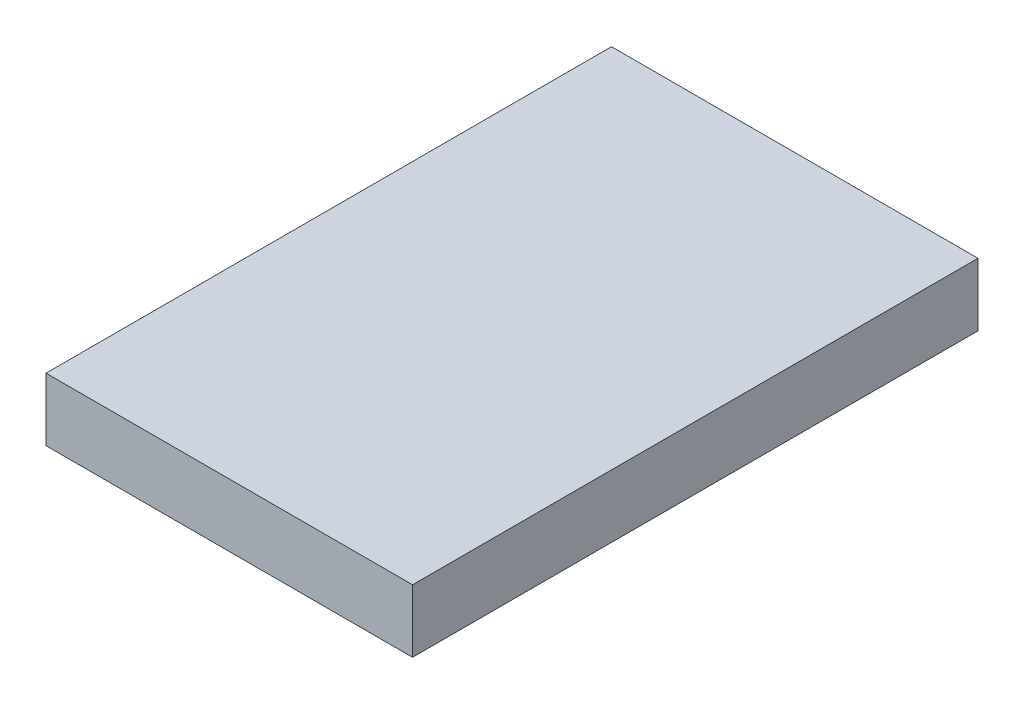
ISO-10303-21;
HEADER;
FILE_DESCRIPTION(('STEP AP214'),'2;1');
FILE_NAME('part.step','',(''),(''),'','','');
FILE_SCHEMA(('AUTOMOTIVE_DESIGN { 1 0 10303 214 1 1 1 1 }'));
ENDSEC;
DATA;
#1=APPLICATION_CONTEXT('core data for automotive mechanical design processes');
#2=APPLICATION_PROTOCOL_DEFINITION('international standard','automotive_design',2000,#1);
#3=PRODUCT_CONTEXT('',#1,'mechanical');
#4=PRODUCT('Part','Part','',(#3));
#5=PRODUCT_RELATED_PRODUCT_CATEGORY('part','',(#4));
#6=PRODUCT_DEFINITION_FORMATION('','',#4);
#7=PRODUCT_DEFINITION_CONTEXT('part definition',#1,'design');
#8=PRODUCT_DEFINITION('design','',#6,#7);
#9=PRODUCT_DEFINITION_SHAPE('','',#8);
#10=(LENGTH_UNIT() NAMED_UNIT(*) SI_UNIT(.MILLI.,.METRE.));
#11=(NAMED_UNIT(*) PLANE_ANGLE_UNIT() SI_UNIT($,.RADIAN.));
#12=(NAMED_UNIT(*) SI_UNIT($,.STERADIAN.) SOLID_ANGLE_UNIT());
#13=UNCERTAINTY_MEASURE_WITH_UNIT(LENGTH_MEASURE(1.E-05),#10,'distance_accuracy_value','');
#14=(GEOMETRIC_REPRESENTATION_CONTEXT(3) GLOBAL_UNCERTAINTY_ASSIGNED_CONTEXT((#13)) GLOBAL_UNIT_ASSIGNED_CONTEXT((#10,
#11,#12)) REPRESENTATION_CONTEXT('',''));
#15=CARTESIAN_POINT('',(0.,0.,0.));
#16=DIRECTION('',(0.,0.,1.));
#17=DIRECTION('',(1.,0.,0.));
#18=AXIS2_PLACEMENT_3D('',#15,#16,#17);
#19=CARTESIAN_POINT('',(0.,9.525,0.));
#20=DIRECTION('',(1.,0.,0.));
#21=DIRECTION('',(0.,0.,-1.));
#22=AXIS2_PLACEMENT_3D('',#19,#20,#21);
#23=PLANE('',#22);
#24=DIRECTION('',(0.,0.,1.));
#25=VECTOR('',#24,1.);
#26=CARTESIAN_POINT('',(0.,0.,0.));
#27=LINE('',#26,#25);
#28=CARTESIAN_POINT('',(0.,0.,-85.725));
#29=VERTEX_POINT('',#28);
#30=CARTESIAN_POINT('',(0.,0.,0.));
#31=VERTEX_POINT('',#30);
#32=EDGE_CURVE('E95',#29,#31,#27,.T.);
#33=ORIENTED_EDGE('',*,*,#32,.T.);
#34=DIRECTION('',(0.,-1.,0.));
#35=VECTOR('',#34,1.);
#36=CARTESIAN_POINT('',(0.,9.525,0.));
#37=LINE('',#36,#35);
#38=CARTESIAN_POINT('',(0.,9.525,0.));
#39=VERTEX_POINT('',#38);
#40=EDGE_CURVE('E11',#39,#31,#37,.T.);
#41=ORIENTED_EDGE('',*,*,#40,.F.);
#42=DIRECTION('',(0.,0.,1.));
#43=VECTOR('',#42,1.);
#44=CARTESIAN_POINT('',(0.,9.525,0.));
#45=LINE('',#44,#43);
#46=CARTESIAN_POINT('',(0.,9.525,-85.725));
#47=VERTEX_POINT('',#46);
#48=EDGE_CURVE('E83',#47,#39,#45,.T.);
#49=ORIENTED_EDGE('',*,*,#48,.F.);
#50=DIRECTION('',(0.,-1.,0.));
#51=VECTOR('',#50,1.);
#52=CARTESIAN_POINT('',(0.,9.525,-85.725));
#53=LINE('',#52,#51);
#54=EDGE_CURVE('E91',#47,#29,#53,.T.);
#55=ORIENTED_EDGE('',*,*,#54,.T.);
#56=EDGE_LOOP('',(#33,#41,#49,#55));
#57=FACE_BOUND('',#56,.T.);
#58=ADVANCED_FACE('F32',(#57),#23,.F.);
#59=CARTESIAN_POINT('',(0.,9.525,0.));
#60=DIRECTION('',(0.,0.,-1.));
#61=DIRECTION('',(-1.,0.,0.));
#62=AXIS2_PLACEMENT_3D('',#59,#60,#61);
#63=PLANE('',#62);
#64=DIRECTION('',(1.,0.,0.));
#65=VECTOR('',#64,1.);
#66=CARTESIAN_POINT('',(0.,0.,0.));
#67=LINE('',#66,#65);
#68=CARTESIAN_POINT('',(55.5625,0.,0.));
#69=VERTEX_POINT('',#68);
#70=EDGE_CURVE('E87',#31,#69,#67,.T.);
#71=ORIENTED_EDGE('',*,*,#70,.T.);
#72=DIRECTION('',(0.,-1.,0.));
#73=VECTOR('',#72,1.);
#74=CARTESIAN_POINT('',(55.5625,9.525,0.));
#75=LINE('',#74,#73);
#76=CARTESIAN_POINT('',(55.5625,9.525,0.));
#77=VERTEX_POINT('',#76);
#78=EDGE_CURVE('E40',#77,#69,#75,.T.);
#79=ORIENTED_EDGE('',*,*,#78,.F.);
#80=DIRECTION('',(1.,0.,0.));
#81=VECTOR('',#80,1.);
#82=CARTESIAN_POINT('',(0.,9.525,0.));
#83=LINE('',#82,#81);
#84=EDGE_CURVE('E78',#39,#77,#83,.T.);
#85=ORIENTED_EDGE('',*,*,#84,.F.);
#86=ORIENTED_EDGE('',*,*,#40,.T.);
#87=EDGE_LOOP('',(#71,#79,#85,#86));
#88=FACE_BOUND('',#87,.T.);
#89=ADVANCED_FACE('F86',(#88),#63,.F.);
#90=CARTESIAN_POINT('',(55.5625,9.525,0.));
#91=DIRECTION('',(-1.,0.,0.));
#92=DIRECTION('',(0.,0.,1.));
#93=AXIS2_PLACEMENT_3D('',#90,#91,#92);
#94=PLANE('',#93);
#95=DIRECTION('',(0.,0.,-1.));
#96=VECTOR('',#95,1.);
#97=CARTESIAN_POINT('',(55.5625,0.,0.));
#98=LINE('',#97,#96);
#99=CARTESIAN_POINT('',(55.5625,0.,-85.725));
#100=VERTEX_POINT('',#99);
#101=EDGE_CURVE('E65',#69,#100,#98,.T.);
#102=ORIENTED_EDGE('',*,*,#101,.T.);
#103=DIRECTION('',(0.,-1.,0.));
#104=VECTOR('',#103,1.);
#105=CARTESIAN_POINT('',(55.5625,9.525,-85.725));
#106=LINE('',#105,#104);
#107=CARTESIAN_POINT('',(55.5625,9.525,-85.725));
#108=VERTEX_POINT('',#107);
#109=EDGE_CURVE('E88',#108,#100,#106,.T.);
#110=ORIENTED_EDGE('',*,*,#109,.F.);
#111=DIRECTION('',(0.,0.,-1.));
#112=VECTOR('',#111,1.);
#113=CARTESIAN_POINT('',(55.5625,9.525,0.));
#114=LINE('',#113,#112);
#115=EDGE_CURVE('E81',#77,#108,#114,.T.);
#116=ORIENTED_EDGE('',*,*,#115,.F.);
#117=ORIENTED_EDGE('',*,*,#78,.T.);
#118=EDGE_LOOP('',(#102,#110,#116,#117));
#119=FACE_BOUND('',#118,.T.);
#120=ADVANCED_FACE('F89',(#119),#94,.F.);
#121=CARTESIAN_POINT('',(0.,9.525,-85.725));
#122=DIRECTION('',(0.,0.,1.));
#123=DIRECTION('',(1.,0.,0.));
#124=AXIS2_PLACEMENT_3D('',#121,#122,#123);
#125=PLANE('',#124);
#126=DIRECTION('',(-1.,0.,0.));
#127=VECTOR('',#126,1.);
#128=CARTESIAN_POINT('',(0.,0.,-85.725));
#129=LINE('',#128,#127);
#130=EDGE_CURVE('E71',#100,#29,#129,.T.);
#131=ORIENTED_EDGE('',*,*,#130,.T.);
#132=ORIENTED_EDGE('',*,*,#54,.F.);
#133=DIRECTION('',(-1.,0.,0.));
#134=VECTOR('',#133,1.);
#135=CARTESIAN_POINT('',(0.,9.525,-85.725));
#136=LINE('',#135,#134);
#137=EDGE_CURVE('E48',#108,#47,#136,.T.);
#138=ORIENTED_EDGE('',*,*,#137,.F.);
#139=ORIENTED_EDGE('',*,*,#109,.T.);
#140=EDGE_LOOP('',(#131,#132,#138,#139));
#141=FACE_BOUND('',#140,.T.);
#142=ADVANCED_FACE('F102',(#141),#125,.F.);
#143=CARTESIAN_POINT('',(0.,9.525,0.));
#144=DIRECTION('',(0.,-1.,0.));
#145=DIRECTION('',(0.,0.,-1.));
#146=AXIS2_PLACEMENT_3D('',#143,#144,#145);
#147=PLANE('',#146);
#148=ORIENTED_EDGE('',*,*,#48,.T.);
#149=ORIENTED_EDGE('',*,*,#84,.T.);
#150=ORIENTED_EDGE('',*,*,#115,.T.);
#151=ORIENTED_EDGE('',*,*,#137,.T.);
#152=EDGE_LOOP('',(#148,#149,#150,#151));
#153=FACE_BOUND('',#152,.T.);
#154=ADVANCED_FACE('F79',(#153),#147,.F.);
#155=CARTESIAN_POINT('',(0.,0.,0.));
#156=DIRECTION('',(0.,-1.,0.));
#157=DIRECTION('',(0.,0.,-1.));
#158=AXIS2_PLACEMENT_3D('',#155,#156,#157);
#159=PLANE('',#158);
#160=ORIENTED_EDGE('',*,*,#32,.F.);
#161=ORIENTED_EDGE('',*,*,#130,.F.);
#162=ORIENTED_EDGE('',*,*,#101,.F.);
#163=ORIENTED_EDGE('',*,*,#70,.F.);
#164=EDGE_LOOP('',(#160,#161,#162,#163));
#165=FACE_BOUND('',#164,.T.);
#166=ADVANCED_FACE('F105',(#165),#159,.T.);
#167=CLOSED_SHELL('',(#58,#89,#120,#142,#154,#166));
#168=MANIFOLD_SOLID_BREP('B2',#167);
#169=ADVANCED_BREP_SHAPE_REPRESENTATION('',(#18,#168),#14);
#170=SHAPE_DEFINITION_REPRESENTATION(#9,#169);
ENDSEC;
END-ISO-10303-21;
